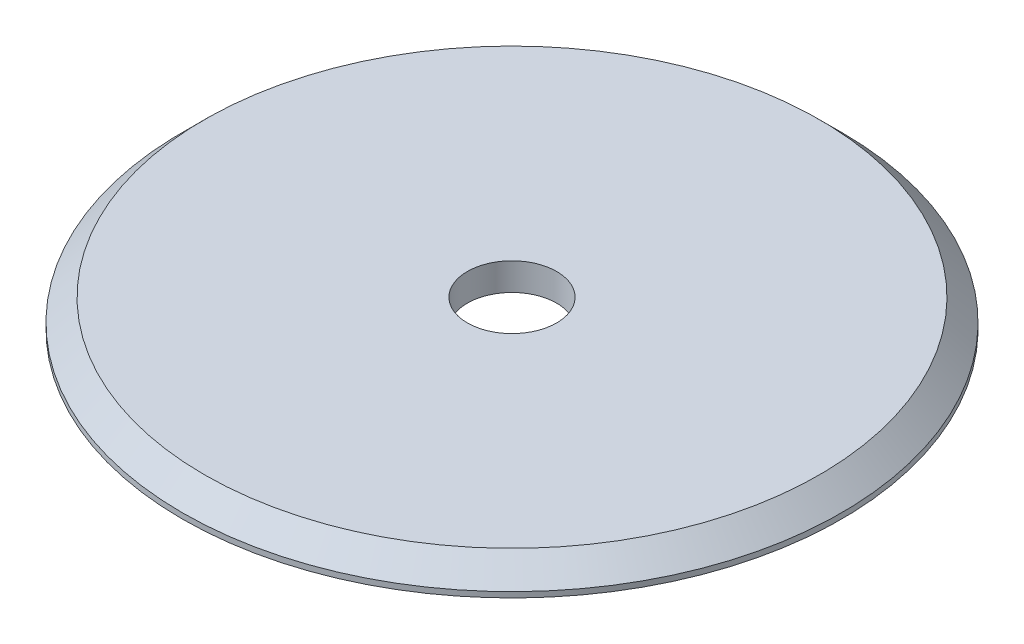
ISO-10303-21;
HEADER;
FILE_DESCRIPTION(('STEP AP214'),'2;1');
FILE_NAME('part.step','',(''),(''),'','','');
FILE_SCHEMA(('AUTOMOTIVE_DESIGN { 1 0 10303 214 1 1 1 1 }'));
ENDSEC;
DATA;
#1=APPLICATION_CONTEXT('core data for automotive mechanical design processes');
#2=APPLICATION_PROTOCOL_DEFINITION('international standard','automotive_design',2000,#1);
#3=PRODUCT_CONTEXT('',#1,'mechanical');
#4=PRODUCT('Part','Part','',(#3));
#5=PRODUCT_RELATED_PRODUCT_CATEGORY('part','',(#4));
#6=PRODUCT_DEFINITION_FORMATION('','',#4);
#7=PRODUCT_DEFINITION_CONTEXT('part definition',#1,'design');
#8=PRODUCT_DEFINITION('design','',#6,#7);
#9=PRODUCT_DEFINITION_SHAPE('','',#8);
#10=(LENGTH_UNIT() NAMED_UNIT(*) SI_UNIT(.MILLI.,.METRE.));
#11=(NAMED_UNIT(*) PLANE_ANGLE_UNIT() SI_UNIT($,.RADIAN.));
#12=(NAMED_UNIT(*) SI_UNIT($,.STERADIAN.) SOLID_ANGLE_UNIT());
#13=UNCERTAINTY_MEASURE_WITH_UNIT(LENGTH_MEASURE(1.E-05),#10,'distance_accuracy_value','');
#14=(GEOMETRIC_REPRESENTATION_CONTEXT(3) GLOBAL_UNCERTAINTY_ASSIGNED_CONTEXT((#13)) GLOBAL_UNIT_ASSIGNED_CONTEXT((#10,
#11,#12)) REPRESENTATION_CONTEXT('',''));
#15=CARTESIAN_POINT('',(0.,0.,0.));
#16=DIRECTION('',(0.,0.,1.));
#17=DIRECTION('',(1.,0.,0.));
#18=AXIS2_PLACEMENT_3D('',#15,#16,#17);
#19=CARTESIAN_POINT('',(0.,0.,0.));
#20=DIRECTION('',(0.,1.,0.));
#21=DIRECTION('',(0.,0.,1.));
#22=AXIS2_PLACEMENT_3D('',#19,#20,#21);
#23=PLANE('',#22);
#24=CARTESIAN_POINT('',(0.,0.,0.));
#25=DIRECTION('',(0.,1.,0.));
#26=DIRECTION('',(0.,0.,1.));
#27=AXIS2_PLACEMENT_3D('',#24,#25,#26);
#28=CIRCLE('',#27,3.25);
#29=CARTESIAN_POINT('',(0.,0.,3.25));
#30=VERTEX_POINT('',#29);
#31=EDGE_CURVE('E71',#30,#30,#28,.T.);
#32=ORIENTED_EDGE('',*,*,#31,.T.);
#33=EDGE_LOOP('',(#32));
#34=FACE_BOUND('',#33,.T.);
#35=CARTESIAN_POINT('',(0.,0.,0.));
#36=DIRECTION('',(0.,-1.,0.));
#37=DIRECTION('',(0.,0.,-1.));
#38=AXIS2_PLACEMENT_3D('',#35,#36,#37);
#39=CIRCLE('',#38,12.);
#40=CARTESIAN_POINT('',(0.,0.,-12.));
#41=VERTEX_POINT('',#40);
#42=EDGE_CURVE('E82',#41,#41,#39,.T.);
#43=ORIENTED_EDGE('',*,*,#42,.T.);
#44=EDGE_LOOP('',(#43));
#45=FACE_BOUND('',#44,.T.);
#46=ADVANCED_FACE('F43',(#34,#45),#23,.F.);
#47=CARTESIAN_POINT('',(0.,2.,0.));
#48=DIRECTION('',(0.,1.,0.));
#49=DIRECTION('',(0.,0.,1.));
#50=AXIS2_PLACEMENT_3D('',#47,#48,#49);
#51=PLANE('',#50);
#52=CARTESIAN_POINT('',(0.,2.,0.));
#53=DIRECTION('',(0.,1.,0.));
#54=DIRECTION('',(0.,0.,1.));
#55=AXIS2_PLACEMENT_3D('',#52,#53,#54);
#56=CIRCLE('',#55,22.4);
#57=CARTESIAN_POINT('',(0.,2.,22.4));
#58=VERTEX_POINT('',#57);
#59=EDGE_CURVE('E59',#58,#58,#56,.T.);
#60=ORIENTED_EDGE('',*,*,#59,.T.);
#61=EDGE_LOOP('',(#60));
#62=FACE_BOUND('',#61,.T.);
#63=CARTESIAN_POINT('',(0.,2.,0.));
#64=DIRECTION('',(0.,1.,0.));
#65=DIRECTION('',(0.,0.,1.));
#66=AXIS2_PLACEMENT_3D('',#63,#64,#65);
#67=CIRCLE('',#66,3.25);
#68=CARTESIAN_POINT('',(0.,2.,3.25));
#69=VERTEX_POINT('',#68);
#70=EDGE_CURVE('E70',#69,#69,#67,.T.);
#71=ORIENTED_EDGE('',*,*,#70,.F.);
#72=EDGE_LOOP('',(#71));
#73=FACE_BOUND('',#72,.T.);
#74=ADVANCED_FACE('F107',(#62,#73),#51,.T.);
#75=CARTESIAN_POINT('',(0.,0.,0.));
#76=DIRECTION('',(0.,1.,0.));
#77=DIRECTION('',(0.,0.,1.));
#78=AXIS2_PLACEMENT_3D('',#75,#76,#77);
#79=CIRCLE('',#78,14.);
#80=CARTESIAN_POINT('',(0.,0.,14.));
#81=VERTEX_POINT('',#80);
#82=EDGE_CURVE('E10',#81,#81,#79,.F.);
#83=ORIENTED_EDGE('',*,*,#82,.F.);
#84=EDGE_LOOP('',(#83));
#85=FACE_BOUND('',#84,.T.);
#86=CARTESIAN_POINT('',(0.,0.,0.));
#87=DIRECTION('',(0.,1.,0.));
#88=DIRECTION('',(0.,0.,1.));
#89=AXIS2_PLACEMENT_3D('',#86,#87,#88);
#90=CIRCLE('',#89,24.);
#91=CARTESIAN_POINT('',(0.,0.,24.));
#92=VERTEX_POINT('',#91);
#93=EDGE_CURVE('E64',#92,#92,#90,.T.);
#94=ORIENTED_EDGE('',*,*,#93,.F.);
#95=EDGE_LOOP('',(#94));
#96=FACE_BOUND('',#95,.T.);
#97=ADVANCED_FACE('F110',(#85,#96),#23,.F.);
#98=CARTESIAN_POINT('',(0.,2.,0.));
#99=DIRECTION('',(0.,-1.,0.));
#100=DIRECTION('',(0.,0.,-1.));
#101=AXIS2_PLACEMENT_3D('',#98,#99,#100);
#102=CYLINDRICAL_SURFACE('',#101,24.);
#103=CARTESIAN_POINT('',(0.,0.399999999999996,0.));
#104=DIRECTION('',(0.,1.,0.));
#105=DIRECTION('',(0.,0.,1.));
#106=AXIS2_PLACEMENT_3D('',#103,#104,#105);
#107=CIRCLE('',#106,24.);
#108=CARTESIAN_POINT('',(0.,0.399999999999996,24.));
#109=VERTEX_POINT('',#108);
#110=EDGE_CURVE('E52',#109,#109,#107,.F.);
#111=ORIENTED_EDGE('',*,*,#110,.T.);
#112=EDGE_LOOP('',(#111));
#113=FACE_BOUND('',#112,.T.);
#114=ORIENTED_EDGE('',*,*,#93,.T.);
#115=EDGE_LOOP('',(#114));
#116=FACE_BOUND('',#115,.T.);
#117=ADVANCED_FACE('F118',(#113,#116),#102,.T.);
#118=CARTESIAN_POINT('',(0.,2.,0.));
#119=DIRECTION('',(0.,-1.,0.));
#120=DIRECTION('',(0.,0.,-1.));
#121=AXIS2_PLACEMENT_3D('',#118,#119,#120);
#122=CYLINDRICAL_SURFACE('',#121,3.25);
#123=ORIENTED_EDGE('',*,*,#70,.T.);
#124=EDGE_LOOP('',(#123));
#125=FACE_BOUND('',#124,.T.);
#126=ORIENTED_EDGE('',*,*,#31,.F.);
#127=EDGE_LOOP('',(#126));
#128=FACE_BOUND('',#127,.T.);
#129=ADVANCED_FACE('F103',(#125,#128),#122,.F.);
#130=CARTESIAN_POINT('',(0.,2.,0.));
#131=DIRECTION('',(0.,-1.,0.));
#132=DIRECTION('',(0.,0.,-1.));
#133=AXIS2_PLACEMENT_3D('',#130,#131,#132);
#134=CONICAL_SURFACE('',#133,22.4,0.785398163397448);
#135=ORIENTED_EDGE('',*,*,#110,.F.);
#136=EDGE_LOOP('',(#135));
#137=FACE_BOUND('',#136,.T.);
#138=ORIENTED_EDGE('',*,*,#59,.F.);
#139=EDGE_LOOP('',(#138));
#140=FACE_BOUND('',#139,.T.);
#141=ADVANCED_FACE('F46',(#137,#140),#134,.T.);
#142=CARTESIAN_POINT('',(0.,-0.6,0.));
#143=DIRECTION('',(0.,-1.,0.));
#144=DIRECTION('',(0.,0.,-1.));
#145=AXIS2_PLACEMENT_3D('',#142,#143,#144);
#146=PLANE('',#145);
#147=CARTESIAN_POINT('',(0.,-0.6,0.));
#148=DIRECTION('',(0.,-1.,0.));
#149=DIRECTION('',(0.,0.,-1.));
#150=AXIS2_PLACEMENT_3D('',#147,#148,#149);
#151=CIRCLE('',#150,14.);
#152=CARTESIAN_POINT('',(0.,-0.6,-14.));
#153=VERTEX_POINT('',#152);
#154=EDGE_CURVE('E74',#153,#153,#151,.T.);
#155=ORIENTED_EDGE('',*,*,#154,.T.);
#156=EDGE_LOOP('',(#155));
#157=FACE_BOUND('',#156,.T.);
#158=CARTESIAN_POINT('',(0.,-0.6,0.));
#159=DIRECTION('',(0.,-1.,0.));
#160=DIRECTION('',(0.,0.,-1.));
#161=AXIS2_PLACEMENT_3D('',#158,#159,#160);
#162=CIRCLE('',#161,12.);
#163=CARTESIAN_POINT('',(0.,-0.6,-12.));
#164=VERTEX_POINT('',#163);
#165=EDGE_CURVE('E81',#164,#164,#162,.T.);
#166=ORIENTED_EDGE('',*,*,#165,.F.);
#167=EDGE_LOOP('',(#166));
#168=FACE_BOUND('',#167,.T.);
#169=ADVANCED_FACE('F92',(#157,#168),#146,.T.);
#170=CARTESIAN_POINT('',(0.,-0.6,0.));
#171=DIRECTION('',(0.,1.,0.));
#172=DIRECTION('',(0.,0.,1.));
#173=AXIS2_PLACEMENT_3D('',#170,#171,#172);
#174=CYLINDRICAL_SURFACE('',#173,14.);
#175=ORIENTED_EDGE('',*,*,#154,.F.);
#176=EDGE_LOOP('',(#175));
#177=FACE_BOUND('',#176,.T.);
#178=ORIENTED_EDGE('',*,*,#82,.T.);
#179=EDGE_LOOP('',(#178));
#180=FACE_BOUND('',#179,.T.);
#181=ADVANCED_FACE('F94',(#177,#180),#174,.T.);
#182=CARTESIAN_POINT('',(0.,-0.6,0.));
#183=DIRECTION('',(0.,1.,0.));
#184=DIRECTION('',(0.,0.,1.));
#185=AXIS2_PLACEMENT_3D('',#182,#183,#184);
#186=CYLINDRICAL_SURFACE('',#185,12.);
#187=ORIENTED_EDGE('',*,*,#165,.T.);
#188=EDGE_LOOP('',(#187));
#189=FACE_BOUND('',#188,.T.);
#190=ORIENTED_EDGE('',*,*,#42,.F.);
#191=EDGE_LOOP('',(#190));
#192=FACE_BOUND('',#191,.T.);
#193=ADVANCED_FACE('F89',(#189,#192),#186,.F.);
#194=CLOSED_SHELL('',(#46,#74,#97,#117,#129,#141,#169,#181,#193));
#195=MANIFOLD_SOLID_BREP('B2',#194);
#196=ADVANCED_BREP_SHAPE_REPRESENTATION('',(#18,#195),#14);
#197=SHAPE_DEFINITION_REPRESENTATION(#9,#196);
ENDSEC;
END-ISO-10303-21;
